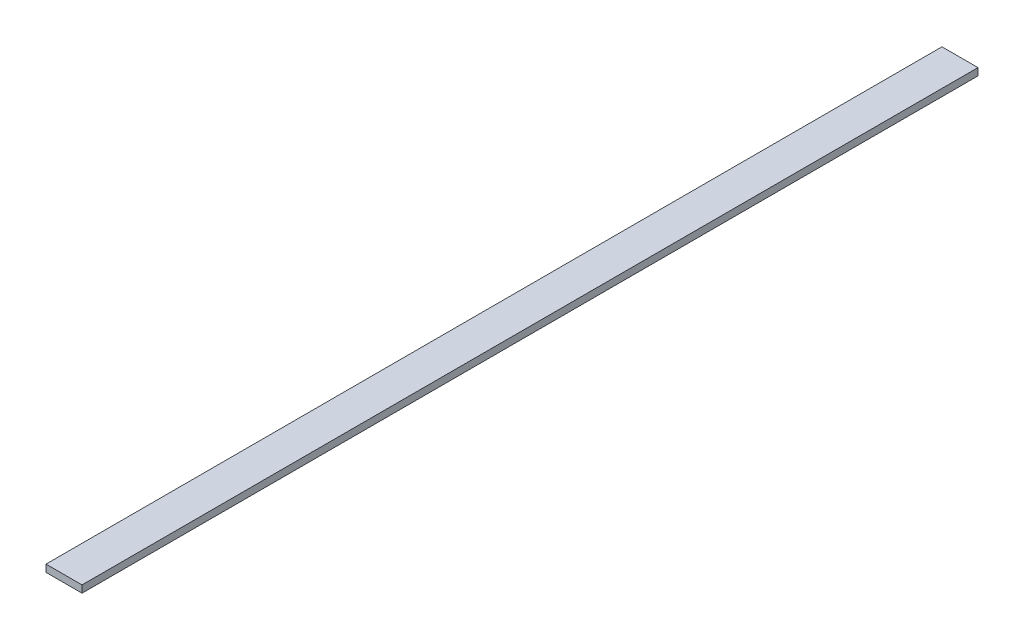
ISO-10303-21;
HEADER;
FILE_DESCRIPTION(('STEP AP214'),'2;1');
FILE_NAME('part.step','',(''),(''),'','','');
FILE_SCHEMA(('AUTOMOTIVE_DESIGN { 1 0 10303 214 1 1 1 1 }'));
ENDSEC;
DATA;
#1=APPLICATION_CONTEXT('core data for automotive mechanical design processes');
#2=APPLICATION_PROTOCOL_DEFINITION('international standard','automotive_design',2000,#1);
#3=PRODUCT_CONTEXT('',#1,'mechanical');
#4=PRODUCT('Part','Part','',(#3));
#5=PRODUCT_RELATED_PRODUCT_CATEGORY('part','',(#4));
#6=PRODUCT_DEFINITION_FORMATION('','',#4);
#7=PRODUCT_DEFINITION_CONTEXT('part definition',#1,'design');
#8=PRODUCT_DEFINITION('design','',#6,#7);
#9=PRODUCT_DEFINITION_SHAPE('','',#8);
#10=(LENGTH_UNIT() NAMED_UNIT(*) SI_UNIT(.MILLI.,.METRE.));
#11=(NAMED_UNIT(*) PLANE_ANGLE_UNIT() SI_UNIT($,.RADIAN.));
#12=(NAMED_UNIT(*) SI_UNIT($,.STERADIAN.) SOLID_ANGLE_UNIT());
#13=UNCERTAINTY_MEASURE_WITH_UNIT(LENGTH_MEASURE(1.E-05),#10,'distance_accuracy_value','');
#14=(GEOMETRIC_REPRESENTATION_CONTEXT(3) GLOBAL_UNCERTAINTY_ASSIGNED_CONTEXT((#13)) GLOBAL_UNIT_ASSIGNED_CONTEXT((#10,
#11,#12)) REPRESENTATION_CONTEXT('',''));
#15=CARTESIAN_POINT('',(0.,0.,0.));
#16=DIRECTION('',(0.,0.,1.));
#17=DIRECTION('',(1.,0.,0.));
#18=AXIS2_PLACEMENT_3D('',#15,#16,#17);
#19=CARTESIAN_POINT('',(0.,0.,311.));
#20=DIRECTION('',(1.,0.,0.));
#21=DIRECTION('',(0.,0.,-1.));
#22=AXIS2_PLACEMENT_3D('',#19,#20,#21);
#23=PLANE('',#22);
#24=DIRECTION('',(0.,-1.,0.));
#25=VECTOR('',#24,1.);
#26=CARTESIAN_POINT('',(0.,0.,0.));
#27=LINE('',#26,#25);
#28=CARTESIAN_POINT('',(0.,2.5,0.));
#29=VERTEX_POINT('',#28);
#30=CARTESIAN_POINT('',(0.,0.,0.));
#31=VERTEX_POINT('',#30);
#32=EDGE_CURVE('E107',#29,#31,#27,.T.);
#33=ORIENTED_EDGE('',*,*,#32,.T.);
#34=DIRECTION('',(0.,0.,-1.));
#35=VECTOR('',#34,1.);
#36=CARTESIAN_POINT('',(0.,0.,311.));
#37=LINE('',#36,#35);
#38=CARTESIAN_POINT('',(0.,0.,311.));
#39=VERTEX_POINT('',#38);
#40=EDGE_CURVE('E11',#39,#31,#37,.T.);
#41=ORIENTED_EDGE('',*,*,#40,.F.);
#42=DIRECTION('',(0.,-1.,0.));
#43=VECTOR('',#42,1.);
#44=CARTESIAN_POINT('',(0.,0.,311.));
#45=LINE('',#44,#43);
#46=CARTESIAN_POINT('',(0.,2.5,311.));
#47=VERTEX_POINT('',#46);
#48=EDGE_CURVE('E95',#47,#39,#45,.T.);
#49=ORIENTED_EDGE('',*,*,#48,.F.);
#50=DIRECTION('',(0.,0.,-1.));
#51=VECTOR('',#50,1.);
#52=CARTESIAN_POINT('',(0.,2.5,311.));
#53=LINE('',#52,#51);
#54=EDGE_CURVE('E103',#47,#29,#53,.T.);
#55=ORIENTED_EDGE('',*,*,#54,.T.);
#56=EDGE_LOOP('',(#33,#41,#49,#55));
#57=FACE_BOUND('',#56,.T.);
#58=ADVANCED_FACE('F44',(#57),#23,.F.);
#59=CARTESIAN_POINT('',(0.,0.,311.));
#60=DIRECTION('',(0.,1.,0.));
#61=DIRECTION('',(0.,0.,1.));
#62=AXIS2_PLACEMENT_3D('',#59,#60,#61);
#63=PLANE('',#62);
#64=DIRECTION('',(1.,0.,0.));
#65=VECTOR('',#64,1.);
#66=CARTESIAN_POINT('',(0.,0.,0.));
#67=LINE('',#66,#65);
#68=CARTESIAN_POINT('',(12.5,0.,0.));
#69=VERTEX_POINT('',#68);
#70=EDGE_CURVE('E99',#31,#69,#67,.T.);
#71=ORIENTED_EDGE('',*,*,#70,.T.);
#72=DIRECTION('',(0.,0.,-1.));
#73=VECTOR('',#72,1.);
#74=CARTESIAN_POINT('',(12.5,0.,311.));
#75=LINE('',#74,#73);
#76=CARTESIAN_POINT('',(12.5,0.,311.));
#77=VERTEX_POINT('',#76);
#78=EDGE_CURVE('E52',#77,#69,#75,.T.);
#79=ORIENTED_EDGE('',*,*,#78,.F.);
#80=DIRECTION('',(1.,0.,0.));
#81=VECTOR('',#80,1.);
#82=CARTESIAN_POINT('',(0.,0.,311.));
#83=LINE('',#82,#81);
#84=EDGE_CURVE('E90',#39,#77,#83,.T.);
#85=ORIENTED_EDGE('',*,*,#84,.F.);
#86=ORIENTED_EDGE('',*,*,#40,.T.);
#87=EDGE_LOOP('',(#71,#79,#85,#86));
#88=FACE_BOUND('',#87,.T.);
#89=ADVANCED_FACE('F98',(#88),#63,.F.);
#90=CARTESIAN_POINT('',(12.5,0.,311.));
#91=DIRECTION('',(-1.,0.,0.));
#92=DIRECTION('',(0.,0.,1.));
#93=AXIS2_PLACEMENT_3D('',#90,#91,#92);
#94=PLANE('',#93);
#95=DIRECTION('',(0.,1.,0.));
#96=VECTOR('',#95,1.);
#97=CARTESIAN_POINT('',(12.5,0.,0.));
#98=LINE('',#97,#96);
#99=CARTESIAN_POINT('',(12.5,2.5,0.));
#100=VERTEX_POINT('',#99);
#101=EDGE_CURVE('E77',#69,#100,#98,.T.);
#102=ORIENTED_EDGE('',*,*,#101,.T.);
#103=DIRECTION('',(0.,0.,-1.));
#104=VECTOR('',#103,1.);
#105=CARTESIAN_POINT('',(12.5,2.5,311.));
#106=LINE('',#105,#104);
#107=CARTESIAN_POINT('',(12.5,2.5,311.));
#108=VERTEX_POINT('',#107);
#109=EDGE_CURVE('E100',#108,#100,#106,.T.);
#110=ORIENTED_EDGE('',*,*,#109,.F.);
#111=DIRECTION('',(0.,1.,0.));
#112=VECTOR('',#111,1.);
#113=CARTESIAN_POINT('',(12.5,0.,311.));
#114=LINE('',#113,#112);
#115=EDGE_CURVE('E93',#77,#108,#114,.T.);
#116=ORIENTED_EDGE('',*,*,#115,.F.);
#117=ORIENTED_EDGE('',*,*,#78,.T.);
#118=EDGE_LOOP('',(#102,#110,#116,#117));
#119=FACE_BOUND('',#118,.T.);
#120=ADVANCED_FACE('F101',(#119),#94,.F.);
#121=CARTESIAN_POINT('',(0.,2.5,311.));
#122=DIRECTION('',(0.,-1.,0.));
#123=DIRECTION('',(0.,0.,-1.));
#124=AXIS2_PLACEMENT_3D('',#121,#122,#123);
#125=PLANE('',#124);
#126=DIRECTION('',(-1.,0.,0.));
#127=VECTOR('',#126,1.);
#128=CARTESIAN_POINT('',(0.,2.5,0.));
#129=LINE('',#128,#127);
#130=EDGE_CURVE('E83',#100,#29,#129,.T.);
#131=ORIENTED_EDGE('',*,*,#130,.T.);
#132=ORIENTED_EDGE('',*,*,#54,.F.);
#133=DIRECTION('',(-1.,0.,0.));
#134=VECTOR('',#133,1.);
#135=CARTESIAN_POINT('',(0.,2.5,311.));
#136=LINE('',#135,#134);
#137=EDGE_CURVE('E60',#108,#47,#136,.T.);
#138=ORIENTED_EDGE('',*,*,#137,.F.);
#139=ORIENTED_EDGE('',*,*,#109,.T.);
#140=EDGE_LOOP('',(#131,#132,#138,#139));
#141=FACE_BOUND('',#140,.T.);
#142=ADVANCED_FACE('F114',(#141),#125,.F.);
#143=CARTESIAN_POINT('',(0.,0.,311.));
#144=DIRECTION('',(0.,0.,-1.));
#145=DIRECTION('',(-1.,0.,0.));
#146=AXIS2_PLACEMENT_3D('',#143,#144,#145);
#147=PLANE('',#146);
#148=ORIENTED_EDGE('',*,*,#48,.T.);
#149=ORIENTED_EDGE('',*,*,#84,.T.);
#150=ORIENTED_EDGE('',*,*,#115,.T.);
#151=ORIENTED_EDGE('',*,*,#137,.T.);
#152=EDGE_LOOP('',(#148,#149,#150,#151));
#153=FACE_BOUND('',#152,.T.);
#154=ADVANCED_FACE('F91',(#153),#147,.F.);
#155=CARTESIAN_POINT('',(0.,0.,0.));
#156=DIRECTION('',(0.,0.,-1.));
#157=DIRECTION('',(-1.,0.,0.));
#158=AXIS2_PLACEMENT_3D('',#155,#156,#157);
#159=PLANE('',#158);
#160=ORIENTED_EDGE('',*,*,#32,.F.);
#161=ORIENTED_EDGE('',*,*,#130,.F.);
#162=ORIENTED_EDGE('',*,*,#101,.F.);
#163=ORIENTED_EDGE('',*,*,#70,.F.);
#164=EDGE_LOOP('',(#160,#161,#162,#163));
#165=FACE_BOUND('',#164,.T.);
#166=ADVANCED_FACE('F117',(#165),#159,.T.);
#167=CLOSED_SHELL('',(#58,#89,#120,#142,#154,#166));
#168=MANIFOLD_SOLID_BREP('B2',#167);
#169=ADVANCED_BREP_SHAPE_REPRESENTATION('',(#18,#168),#14);
#170=SHAPE_DEFINITION_REPRESENTATION(#9,#169);
ENDSEC;
END-ISO-10303-21;
